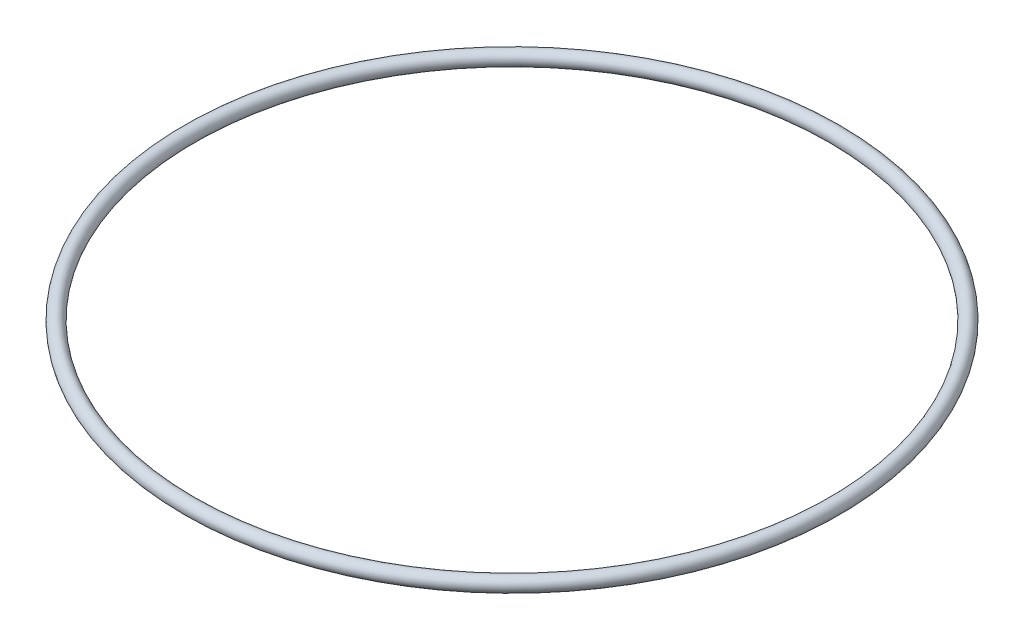
ISO-10303-21;
HEADER;
FILE_DESCRIPTION(('STEP AP214'),'2;1');
FILE_NAME('part.step','',(''),(''),'','','');
FILE_SCHEMA(('AUTOMOTIVE_DESIGN { 1 0 10303 214 1 1 1 1 }'));
ENDSEC;
DATA;
#1=APPLICATION_CONTEXT('core data for automotive mechanical design processes');
#2=APPLICATION_PROTOCOL_DEFINITION('international standard','automotive_design',2000,#1);
#3=PRODUCT_CONTEXT('',#1,'mechanical');
#4=PRODUCT('Part','Part','',(#3));
#5=PRODUCT_RELATED_PRODUCT_CATEGORY('part','',(#4));
#6=PRODUCT_DEFINITION_FORMATION('','',#4);
#7=PRODUCT_DEFINITION_CONTEXT('part definition',#1,'design');
#8=PRODUCT_DEFINITION('design','',#6,#7);
#9=PRODUCT_DEFINITION_SHAPE('','',#8);
#10=(LENGTH_UNIT() NAMED_UNIT(*) SI_UNIT(.MILLI.,.METRE.));
#11=(NAMED_UNIT(*) PLANE_ANGLE_UNIT() SI_UNIT($,.RADIAN.));
#12=(NAMED_UNIT(*) SI_UNIT($,.STERADIAN.) SOLID_ANGLE_UNIT());
#13=UNCERTAINTY_MEASURE_WITH_UNIT(LENGTH_MEASURE(1.E-05),#10,'distance_accuracy_value','');
#14=(GEOMETRIC_REPRESENTATION_CONTEXT(3) GLOBAL_UNCERTAINTY_ASSIGNED_CONTEXT((#13)) GLOBAL_UNIT_ASSIGNED_CONTEXT((#10,
#11,#12)) REPRESENTATION_CONTEXT('',''));
#15=CARTESIAN_POINT('',(0.,0.,0.));
#16=DIRECTION('',(0.,0.,1.));
#17=DIRECTION('',(1.,0.,0.));
#18=AXIS2_PLACEMENT_3D('',#15,#16,#17);
#19=CARTESIAN_POINT('',(0.,0.380999999999993,0.));
#20=DIRECTION('',(0.,-1.,0.));
#21=DIRECTION('',(0.,0.,-1.));
#22=AXIS2_PLACEMENT_3D('',#19,#20,#21);
#23=TOROIDAL_SURFACE('',#22,40.259,0.889000000000003);
#24=ADVANCED_FACE('F13',(),#23,.T.);
#25=CLOSED_SHELL('',(#24));
#26=MANIFOLD_SOLID_BREP('B1',#25);
#27=ADVANCED_BREP_SHAPE_REPRESENTATION('',(#18,#26),#14);
#28=SHAPE_DEFINITION_REPRESENTATION(#9,#27);
ENDSEC;
END-ISO-10303-21;
